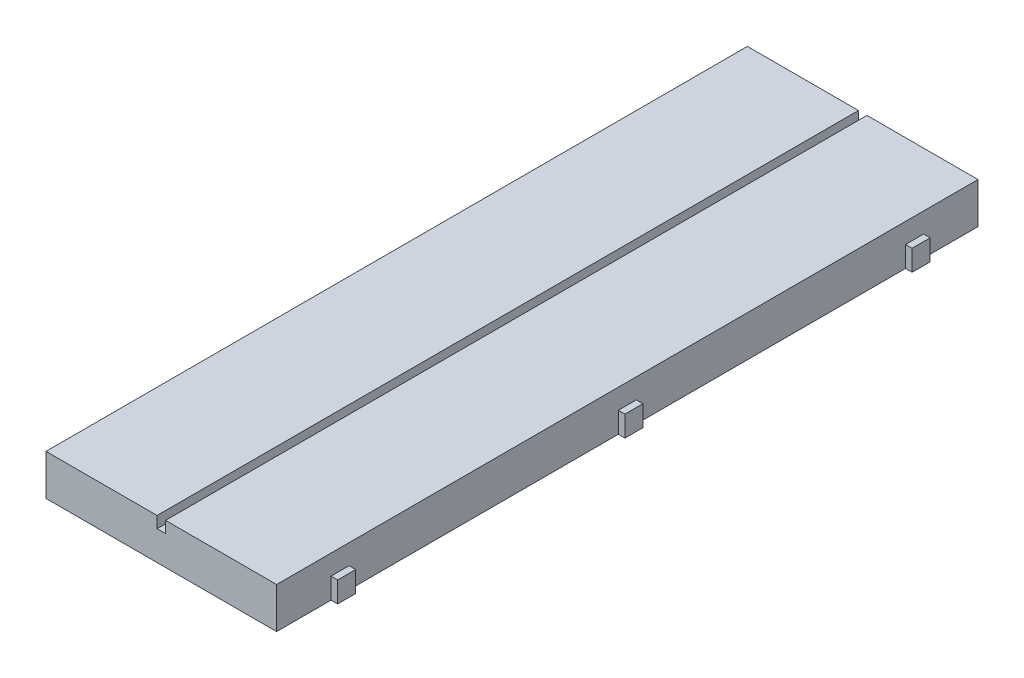
ISO-10303-21;
HEADER;
FILE_DESCRIPTION(('STEP AP214'),'2;1');
FILE_NAME('part.step','',(''),(''),'','','');
FILE_SCHEMA(('AUTOMOTIVE_DESIGN { 1 0 10303 214 1 1 1 1 }'));
ENDSEC;
DATA;
#1=APPLICATION_CONTEXT('core data for automotive mechanical design processes');
#2=APPLICATION_PROTOCOL_DEFINITION('international standard','automotive_design',2000,#1);
#3=PRODUCT_CONTEXT('',#1,'mechanical');
#4=PRODUCT('Part','Part','',(#3));
#5=PRODUCT_RELATED_PRODUCT_CATEGORY('part','',(#4));
#6=PRODUCT_DEFINITION_FORMATION('','',#4);
#7=PRODUCT_DEFINITION_CONTEXT('part definition',#1,'design');
#8=PRODUCT_DEFINITION('design','',#6,#7);
#9=PRODUCT_DEFINITION_SHAPE('','',#8);
#10=(LENGTH_UNIT() NAMED_UNIT(*) SI_UNIT(.MILLI.,.METRE.));
#11=(NAMED_UNIT(*) PLANE_ANGLE_UNIT() SI_UNIT($,.RADIAN.));
#12=(NAMED_UNIT(*) SI_UNIT($,.STERADIAN.) SOLID_ANGLE_UNIT());
#13=UNCERTAINTY_MEASURE_WITH_UNIT(LENGTH_MEASURE(1.E-05),#10,'distance_accuracy_value','');
#14=(GEOMETRIC_REPRESENTATION_CONTEXT(3) GLOBAL_UNCERTAINTY_ASSIGNED_CONTEXT((#13)) GLOBAL_UNIT_ASSIGNED_CONTEXT((#10,
#11,#12)) REPRESENTATION_CONTEXT('',''));
#15=CARTESIAN_POINT('',(0.,0.,0.));
#16=DIRECTION('',(0.,0.,1.));
#17=DIRECTION('',(1.,0.,0.));
#18=AXIS2_PLACEMENT_3D('',#15,#16,#17);
#19=CARTESIAN_POINT('',(0.,0.,0.));
#20=DIRECTION('',(0.,-1.,0.));
#21=DIRECTION('',(0.,0.,-1.));
#22=AXIS2_PLACEMENT_3D('',#19,#20,#21);
#23=PLANE('',#22);
#24=DIRECTION('',(-1.,0.,0.));
#25=VECTOR('',#24,1.);
#26=CARTESIAN_POINT('',(-27.125,0.,-82.5));
#27=LINE('',#26,#25);
#28=CARTESIAN_POINT('',(27.125,0.,-82.5));
#29=VERTEX_POINT('',#28);
#30=CARTESIAN_POINT('',(1.,0.,-82.5));
#31=VERTEX_POINT('',#30);
#32=EDGE_CURVE('E464',#29,#31,#27,.T.);
#33=ORIENTED_EDGE('',*,*,#32,.T.);
#34=DIRECTION('',(0.,0.,-1.));
#35=VECTOR('',#34,1.);
#36=CARTESIAN_POINT('',(1.,0.,82.5));
#37=LINE('',#36,#35);
#38=CARTESIAN_POINT('',(1.,0.,82.5));
#39=VERTEX_POINT('',#38);
#40=EDGE_CURVE('E255',#39,#31,#37,.T.);
#41=ORIENTED_EDGE('',*,*,#40,.F.);
#42=DIRECTION('',(1.,0.,0.));
#43=VECTOR('',#42,1.);
#44=CARTESIAN_POINT('',(-27.125,0.,82.5));
#45=LINE('',#44,#43);
#46=CARTESIAN_POINT('',(27.125,0.,82.5));
#47=VERTEX_POINT('',#46);
#48=EDGE_CURVE('E469',#39,#47,#45,.T.);
#49=ORIENTED_EDGE('',*,*,#48,.T.);
#50=DIRECTION('',(0.,0.,-1.));
#51=VECTOR('',#50,1.);
#52=CARTESIAN_POINT('',(27.125,0.,82.5));
#53=LINE('',#52,#51);
#54=EDGE_CURVE('E443',#47,#29,#53,.T.);
#55=ORIENTED_EDGE('',*,*,#54,.T.);
#56=EDGE_LOOP('',(#33,#41,#49,#55));
#57=FACE_BOUND('',#56,.T.);
#58=ADVANCED_FACE('F39',(#57),#23,.F.);
#59=CARTESIAN_POINT('',(27.125,-9.6,82.5));
#60=DIRECTION('',(1.,0.,0.));
#61=DIRECTION('',(0.,0.,-1.));
#62=AXIS2_PLACEMENT_3D('',#59,#60,#61);
#63=PLANE('',#62);
#64=DIRECTION('',(0.,0.,-1.));
#65=VECTOR('',#64,1.);
#66=CARTESIAN_POINT('',(27.125,-4.70000000000002,82.5));
#67=LINE('',#66,#65);
#68=CARTESIAN_POINT('',(27.125,-4.70000000000002,69.7));
#69=VERTEX_POINT('',#68);
#70=CARTESIAN_POINT('',(27.125,-4.70000000000002,65.4499999999999));
#71=VERTEX_POINT('',#70);
#72=EDGE_CURVE('E11',#69,#71,#67,.T.);
#73=ORIENTED_EDGE('',*,*,#72,.T.);
#74=DIRECTION('',(0.,-1.,0.));
#75=VECTOR('',#74,1.);
#76=CARTESIAN_POINT('',(27.125,-9.6,65.4499999999999));
#77=LINE('',#76,#75);
#78=CARTESIAN_POINT('',(27.125,-9.6,65.4499999999999));
#79=VERTEX_POINT('',#78);
#80=EDGE_CURVE('E389',#71,#79,#77,.T.);
#81=ORIENTED_EDGE('',*,*,#80,.T.);
#82=DIRECTION('',(0.,0.,-1.));
#83=VECTOR('',#82,1.);
#84=CARTESIAN_POINT('',(27.125,-9.6,82.5));
#85=LINE('',#84,#83);
#86=CARTESIAN_POINT('',(27.125,-9.6,2.125));
#87=VERTEX_POINT('',#86);
#88=EDGE_CURVE('E448',#79,#87,#85,.T.);
#89=ORIENTED_EDGE('',*,*,#88,.T.);
#90=DIRECTION('',(0.,-1.,0.));
#91=VECTOR('',#90,1.);
#92=CARTESIAN_POINT('',(27.125,-9.60000000000001,2.125));
#93=LINE('',#92,#91);
#94=CARTESIAN_POINT('',(27.125,-4.7,2.125));
#95=VERTEX_POINT('',#94);
#96=EDGE_CURVE('E415',#95,#87,#93,.T.);
#97=ORIENTED_EDGE('',*,*,#96,.F.);
#98=DIRECTION('',(0.,0.,-1.));
#99=VECTOR('',#98,1.);
#100=CARTESIAN_POINT('',(27.125,-4.7,82.5));
#101=LINE('',#100,#99);
#102=CARTESIAN_POINT('',(27.125,-4.7,-2.125));
#103=VERTEX_POINT('',#102);
#104=EDGE_CURVE('E47',#95,#103,#101,.T.);
#105=ORIENTED_EDGE('',*,*,#104,.T.);
#106=DIRECTION('',(0.,-1.,0.));
#107=VECTOR('',#106,1.);
#108=CARTESIAN_POINT('',(27.125,-9.60000000000001,-2.125));
#109=LINE('',#108,#107);
#110=CARTESIAN_POINT('',(27.125,-9.6,-2.125));
#111=VERTEX_POINT('',#110);
#112=EDGE_CURVE('E412',#103,#111,#109,.T.);
#113=ORIENTED_EDGE('',*,*,#112,.T.);
#114=CARTESIAN_POINT('',(27.125,-9.6,-65.4499999999999));
#115=VERTEX_POINT('',#114);
#116=EDGE_CURVE('E505',#111,#115,#85,.T.);
#117=ORIENTED_EDGE('',*,*,#116,.T.);
#118=DIRECTION('',(0.,1.,0.));
#119=VECTOR('',#118,1.);
#120=CARTESIAN_POINT('',(27.125,-9.6,-65.4499999999999));
#121=LINE('',#120,#119);
#122=CARTESIAN_POINT('',(27.125,-4.7,-65.4499999999999));
#123=VERTEX_POINT('',#122);
#124=EDGE_CURVE('E438',#115,#123,#121,.T.);
#125=ORIENTED_EDGE('',*,*,#124,.T.);
#126=DIRECTION('',(0.,0.,-1.));
#127=VECTOR('',#126,1.);
#128=CARTESIAN_POINT('',(27.125,-4.7,82.5));
#129=LINE('',#128,#127);
#130=CARTESIAN_POINT('',(27.125,-4.7,-69.7));
#131=VERTEX_POINT('',#130);
#132=EDGE_CURVE('E476',#123,#131,#129,.T.);
#133=ORIENTED_EDGE('',*,*,#132,.T.);
#134=DIRECTION('',(0.,1.,0.));
#135=VECTOR('',#134,1.);
#136=CARTESIAN_POINT('',(27.125,-9.6,-69.7));
#137=LINE('',#136,#135);
#138=CARTESIAN_POINT('',(27.125,-9.6,-69.7));
#139=VERTEX_POINT('',#138);
#140=EDGE_CURVE('E441',#139,#131,#137,.T.);
#141=ORIENTED_EDGE('',*,*,#140,.F.);
#142=CARTESIAN_POINT('',(27.125,-9.6,-82.5));
#143=VERTEX_POINT('',#142);
#144=EDGE_CURVE('E449',#139,#143,#85,.T.);
#145=ORIENTED_EDGE('',*,*,#144,.T.);
#146=DIRECTION('',(0.,1.,0.));
#147=VECTOR('',#146,1.);
#148=CARTESIAN_POINT('',(27.125,-9.6,-82.5));
#149=LINE('',#148,#147);
#150=EDGE_CURVE('E460',#143,#29,#149,.T.);
#151=ORIENTED_EDGE('',*,*,#150,.T.);
#152=ORIENTED_EDGE('',*,*,#54,.F.);
#153=DIRECTION('',(0.,1.,0.));
#154=VECTOR('',#153,1.);
#155=CARTESIAN_POINT('',(27.125,-9.6,82.5));
#156=LINE('',#155,#154);
#157=CARTESIAN_POINT('',(27.125,-9.6,82.5));
#158=VERTEX_POINT('',#157);
#159=EDGE_CURVE('E473',#158,#47,#156,.T.);
#160=ORIENTED_EDGE('',*,*,#159,.F.);
#161=CARTESIAN_POINT('',(27.125,-9.6,69.7));
#162=VERTEX_POINT('',#161);
#163=EDGE_CURVE('E444',#158,#162,#85,.T.);
#164=ORIENTED_EDGE('',*,*,#163,.T.);
#165=DIRECTION('',(0.,-1.,0.));
#166=VECTOR('',#165,1.);
#167=CARTESIAN_POINT('',(27.125,-9.6,69.7));
#168=LINE('',#167,#166);
#169=EDGE_CURVE('E387',#69,#162,#168,.T.);
#170=ORIENTED_EDGE('',*,*,#169,.F.);
#171=EDGE_LOOP('',(#73,#81,#89,#97,#105,#113,#117,#125,#133,#141,#145,#151,#152,#160,#164,#170));
#172=FACE_BOUND('',#171,.T.);
#173=ADVANCED_FACE('F41',(#172),#63,.T.);
#174=CARTESIAN_POINT('',(-27.125,-9.6,82.5));
#175=DIRECTION('',(0.,0.,1.));
#176=DIRECTION('',(1.,0.,0.));
#177=AXIS2_PLACEMENT_3D('',#174,#175,#176);
#178=PLANE('',#177);
#179=DIRECTION('',(0.,1.,0.));
#180=VECTOR('',#179,1.);
#181=CARTESIAN_POINT('',(1.,-2.7,82.5));
#182=LINE('',#181,#180);
#183=CARTESIAN_POINT('',(1.,-2.7,82.5));
#184=VERTEX_POINT('',#183);
#185=EDGE_CURVE('E280',#184,#39,#182,.T.);
#186=ORIENTED_EDGE('',*,*,#185,.F.);
#187=DIRECTION('',(1.,0.,0.));
#188=VECTOR('',#187,1.);
#189=CARTESIAN_POINT('',(-1.,-2.7,82.5));
#190=LINE('',#189,#188);
#191=CARTESIAN_POINT('',(-1.,-2.7,82.5));
#192=VERTEX_POINT('',#191);
#193=EDGE_CURVE('E260',#192,#184,#190,.T.);
#194=ORIENTED_EDGE('',*,*,#193,.F.);
#195=DIRECTION('',(0.,1.,0.));
#196=VECTOR('',#195,1.);
#197=CARTESIAN_POINT('',(-1.,-2.7,82.5));
#198=LINE('',#197,#196);
#199=CARTESIAN_POINT('',(-1.,0.,82.5));
#200=VERTEX_POINT('',#199);
#201=EDGE_CURVE('E283',#192,#200,#198,.T.);
#202=ORIENTED_EDGE('',*,*,#201,.T.);
#203=CARTESIAN_POINT('',(-27.125,0.,82.5));
#204=VERTEX_POINT('',#203);
#205=EDGE_CURVE('E470',#204,#200,#45,.T.);
#206=ORIENTED_EDGE('',*,*,#205,.F.);
#207=DIRECTION('',(0.,1.,0.));
#208=VECTOR('',#207,1.);
#209=CARTESIAN_POINT('',(-27.125,-9.6,82.5));
#210=LINE('',#209,#208);
#211=CARTESIAN_POINT('',(-27.125,-9.6,82.5));
#212=VERTEX_POINT('',#211);
#213=EDGE_CURVE('E477',#212,#204,#210,.T.);
#214=ORIENTED_EDGE('',*,*,#213,.F.);
#215=DIRECTION('',(1.,0.,0.));
#216=VECTOR('',#215,1.);
#217=CARTESIAN_POINT('',(-27.125,-9.6,82.5));
#218=LINE('',#217,#216);
#219=EDGE_CURVE('E456',#212,#158,#218,.T.);
#220=ORIENTED_EDGE('',*,*,#219,.T.);
#221=ORIENTED_EDGE('',*,*,#159,.T.);
#222=ORIENTED_EDGE('',*,*,#48,.F.);
#223=EDGE_LOOP('',(#186,#194,#202,#206,#214,#220,#221,#222));
#224=FACE_BOUND('',#223,.T.);
#225=ADVANCED_FACE('F529',(#224),#178,.T.);
#226=CARTESIAN_POINT('',(-27.125,-9.6,82.5));
#227=DIRECTION('',(-1.,0.,0.));
#228=DIRECTION('',(0.,0.,1.));
#229=AXIS2_PLACEMENT_3D('',#226,#227,#228);
#230=PLANE('',#229);
#231=DIRECTION('',(0.,1.,0.));
#232=VECTOR('',#231,1.);
#233=CARTESIAN_POINT('',(-27.125,-4.7,69.7));
#234=LINE('',#233,#232);
#235=CARTESIAN_POINT('',(-27.125,-9.6,69.7));
#236=VERTEX_POINT('',#235);
#237=CARTESIAN_POINT('',(-27.125,-4.7,69.7));
#238=VERTEX_POINT('',#237);
#239=EDGE_CURVE('E297',#236,#238,#234,.T.);
#240=ORIENTED_EDGE('',*,*,#239,.F.);
#241=DIRECTION('',(0.,0.,1.));
#242=VECTOR('',#241,1.);
#243=CARTESIAN_POINT('',(-27.125,-9.6,82.5));
#244=LINE('',#243,#242);
#245=EDGE_CURVE('E452',#236,#212,#244,.T.);
#246=ORIENTED_EDGE('',*,*,#245,.T.);
#247=ORIENTED_EDGE('',*,*,#213,.T.);
#248=DIRECTION('',(0.,0.,1.));
#249=VECTOR('',#248,1.);
#250=CARTESIAN_POINT('',(-27.125,0.,82.5));
#251=LINE('',#250,#249);
#252=CARTESIAN_POINT('',(-27.125,0.,-82.5));
#253=VERTEX_POINT('',#252);
#254=EDGE_CURVE('E466',#253,#204,#251,.T.);
#255=ORIENTED_EDGE('',*,*,#254,.F.);
#256=DIRECTION('',(0.,1.,0.));
#257=VECTOR('',#256,1.);
#258=CARTESIAN_POINT('',(-27.125,-9.6,-82.5));
#259=LINE('',#258,#257);
#260=CARTESIAN_POINT('',(-27.125,-9.6,-82.5));
#261=VERTEX_POINT('',#260);
#262=EDGE_CURVE('E479',#261,#253,#259,.T.);
#263=ORIENTED_EDGE('',*,*,#262,.F.);
#264=CARTESIAN_POINT('',(-27.125,-9.6,-69.7));
#265=VERTEX_POINT('',#264);
#266=EDGE_CURVE('E453',#261,#265,#244,.T.);
#267=ORIENTED_EDGE('',*,*,#266,.T.);
#268=DIRECTION('',(0.,-1.,0.));
#269=VECTOR('',#268,1.);
#270=CARTESIAN_POINT('',(-27.125,-4.7,-69.7));
#271=LINE('',#270,#269);
#272=CARTESIAN_POINT('',(-27.125,-4.7,-69.7));
#273=VERTEX_POINT('',#272);
#274=EDGE_CURVE('E301',#273,#265,#271,.T.);
#275=ORIENTED_EDGE('',*,*,#274,.F.);
#276=DIRECTION('',(0.,0.,-1.));
#277=VECTOR('',#276,1.);
#278=CARTESIAN_POINT('',(-27.125,-4.7,-69.7));
#279=LINE('',#278,#277);
#280=CARTESIAN_POINT('',(-27.125,-4.7,-65.45));
#281=VERTEX_POINT('',#280);
#282=EDGE_CURVE('E325',#281,#273,#279,.T.);
#283=ORIENTED_EDGE('',*,*,#282,.F.);
#284=DIRECTION('',(0.,1.,0.));
#285=VECTOR('',#284,1.);
#286=CARTESIAN_POINT('',(-27.125,-4.7,-65.45));
#287=LINE('',#286,#285);
#288=CARTESIAN_POINT('',(-27.125,-9.6,-65.45));
#289=VERTEX_POINT('',#288);
#290=EDGE_CURVE('E328',#289,#281,#287,.T.);
#291=ORIENTED_EDGE('',*,*,#290,.F.);
#292=CARTESIAN_POINT('',(-27.125,-9.6,-2.125));
#293=VERTEX_POINT('',#292);
#294=EDGE_CURVE('E457',#289,#293,#244,.T.);
#295=ORIENTED_EDGE('',*,*,#294,.T.);
#296=DIRECTION('',(0.,-1.,0.));
#297=VECTOR('',#296,1.);
#298=CARTESIAN_POINT('',(-27.125,-4.7,-2.125));
#299=LINE('',#298,#297);
#300=CARTESIAN_POINT('',(-27.125,-4.7,-2.125));
#301=VERTEX_POINT('',#300);
#302=EDGE_CURVE('E351',#301,#293,#299,.T.);
#303=ORIENTED_EDGE('',*,*,#302,.F.);
#304=DIRECTION('',(0.,0.,-1.));
#305=VECTOR('',#304,1.);
#306=CARTESIAN_POINT('',(-27.125,-4.7,-2.125));
#307=LINE('',#306,#305);
#308=CARTESIAN_POINT('',(-27.125,-4.7,2.125));
#309=VERTEX_POINT('',#308);
#310=EDGE_CURVE('E353',#309,#301,#307,.T.);
#311=ORIENTED_EDGE('',*,*,#310,.F.);
#312=DIRECTION('',(0.,1.,0.));
#313=VECTOR('',#312,1.);
#314=CARTESIAN_POINT('',(-27.125,-4.7,2.125));
#315=LINE('',#314,#313);
#316=CARTESIAN_POINT('',(-27.125,-9.6,2.125));
#317=VERTEX_POINT('',#316);
#318=EDGE_CURVE('E324',#317,#309,#315,.T.);
#319=ORIENTED_EDGE('',*,*,#318,.F.);
#320=CARTESIAN_POINT('',(-27.125,-9.6,65.45));
#321=VERTEX_POINT('',#320);
#322=EDGE_CURVE('E540',#317,#321,#244,.T.);
#323=ORIENTED_EDGE('',*,*,#322,.T.);
#324=DIRECTION('',(0.,-1.,0.));
#325=VECTOR('',#324,1.);
#326=CARTESIAN_POINT('',(-27.125,-4.7,65.45));
#327=LINE('',#326,#325);
#328=CARTESIAN_POINT('',(-27.125,-4.7,65.45));
#329=VERTEX_POINT('',#328);
#330=EDGE_CURVE('E291',#329,#321,#327,.T.);
#331=ORIENTED_EDGE('',*,*,#330,.F.);
#332=DIRECTION('',(0.,0.,-1.));
#333=VECTOR('',#332,1.);
#334=CARTESIAN_POINT('',(-27.125,-4.7,69.7));
#335=LINE('',#334,#333);
#336=EDGE_CURVE('E300',#238,#329,#335,.T.);
#337=ORIENTED_EDGE('',*,*,#336,.F.);
#338=EDGE_LOOP('',(#240,#246,#247,#255,#263,#267,#275,#283,#291,#295,#303,#311,#319,#323,#331,#337));
#339=FACE_BOUND('',#338,.T.);
#340=ADVANCED_FACE('F521',(#339),#230,.T.);
#341=CARTESIAN_POINT('',(-27.125,-9.6,-82.5));
#342=DIRECTION('',(0.,0.,-1.));
#343=DIRECTION('',(-1.,0.,0.));
#344=AXIS2_PLACEMENT_3D('',#341,#342,#343);
#345=PLANE('',#344);
#346=DIRECTION('',(0.,1.,0.));
#347=VECTOR('',#346,1.);
#348=CARTESIAN_POINT('',(1.,-2.7,-82.5));
#349=LINE('',#348,#347);
#350=CARTESIAN_POINT('',(1.,-2.7,-82.5));
#351=VERTEX_POINT('',#350);
#352=EDGE_CURVE('E249',#351,#31,#349,.T.);
#353=ORIENTED_EDGE('',*,*,#352,.T.);
#354=ORIENTED_EDGE('',*,*,#32,.F.);
#355=ORIENTED_EDGE('',*,*,#150,.F.);
#356=DIRECTION('',(-1.,0.,0.));
#357=VECTOR('',#356,1.);
#358=CARTESIAN_POINT('',(-27.125,-9.6,-82.5));
#359=LINE('',#358,#357);
#360=EDGE_CURVE('E447',#143,#261,#359,.T.);
#361=ORIENTED_EDGE('',*,*,#360,.T.);
#362=ORIENTED_EDGE('',*,*,#262,.T.);
#363=CARTESIAN_POINT('',(-1.,0.,-82.5));
#364=VERTEX_POINT('',#363);
#365=EDGE_CURVE('E463',#364,#253,#27,.T.);
#366=ORIENTED_EDGE('',*,*,#365,.F.);
#367=DIRECTION('',(0.,1.,0.));
#368=VECTOR('',#367,1.);
#369=CARTESIAN_POINT('',(-1.,-2.7,-82.5));
#370=LINE('',#369,#368);
#371=CARTESIAN_POINT('',(-1.,-2.7,-82.5));
#372=VERTEX_POINT('',#371);
#373=EDGE_CURVE('E54',#372,#364,#370,.T.);
#374=ORIENTED_EDGE('',*,*,#373,.F.);
#375=DIRECTION('',(-1.,0.,0.));
#376=VECTOR('',#375,1.);
#377=CARTESIAN_POINT('',(-1.,-2.7,-82.5));
#378=LINE('',#377,#376);
#379=EDGE_CURVE('E266',#351,#372,#378,.T.);
#380=ORIENTED_EDGE('',*,*,#379,.F.);
#381=EDGE_LOOP('',(#353,#354,#355,#361,#362,#366,#374,#380));
#382=FACE_BOUND('',#381,.T.);
#383=ADVANCED_FACE('F271',(#382),#345,.T.);
#384=CARTESIAN_POINT('',(0.,-9.6,0.));
#385=DIRECTION('',(0.,-1.,0.));
#386=DIRECTION('',(0.,0.,-1.));
#387=AXIS2_PLACEMENT_3D('',#384,#385,#386);
#388=PLANE('',#387);
#389=DIRECTION('',(-1.,0.,0.));
#390=VECTOR('',#389,1.);
#391=CARTESIAN_POINT('',(-25.575,-9.6,69.7));
#392=LINE('',#391,#390);
#393=CARTESIAN_POINT('',(-25.575,-9.6,69.7));
#394=VERTEX_POINT('',#393);
#395=EDGE_CURVE('E305',#394,#236,#392,.T.);
#396=ORIENTED_EDGE('',*,*,#395,.F.);
#397=DIRECTION('',(0.,0.,1.));
#398=VECTOR('',#397,1.);
#399=CARTESIAN_POINT('',(-25.575,-9.6,69.7));
#400=LINE('',#399,#398);
#401=CARTESIAN_POINT('',(-25.575,-9.6,65.45));
#402=VERTEX_POINT('',#401);
#403=EDGE_CURVE('E294',#402,#394,#400,.T.);
#404=ORIENTED_EDGE('',*,*,#403,.F.);
#405=DIRECTION('',(-1.,0.,0.));
#406=VECTOR('',#405,1.);
#407=CARTESIAN_POINT('',(-25.575,-9.6,65.45));
#408=LINE('',#407,#406);
#409=EDGE_CURVE('E308',#402,#321,#408,.T.);
#410=ORIENTED_EDGE('',*,*,#409,.T.);
#411=ORIENTED_EDGE('',*,*,#322,.F.);
#412=DIRECTION('',(-1.,0.,0.));
#413=VECTOR('',#412,1.);
#414=CARTESIAN_POINT('',(-25.575,-9.6,2.125));
#415=LINE('',#414,#413);
#416=CARTESIAN_POINT('',(-25.575,-9.6,2.125));
#417=VERTEX_POINT('',#416);
#418=EDGE_CURVE('E282',#417,#317,#415,.T.);
#419=ORIENTED_EDGE('',*,*,#418,.F.);
#420=DIRECTION('',(0.,0.,1.));
#421=VECTOR('',#420,1.);
#422=CARTESIAN_POINT('',(-25.575,-9.6,-2.125));
#423=LINE('',#422,#421);
#424=CARTESIAN_POINT('',(-25.575,-9.6,-2.125));
#425=VERTEX_POINT('',#424);
#426=EDGE_CURVE('E344',#425,#417,#423,.T.);
#427=ORIENTED_EDGE('',*,*,#426,.F.);
#428=DIRECTION('',(-1.,0.,0.));
#429=VECTOR('',#428,1.);
#430=CARTESIAN_POINT('',(-25.575,-9.6,-2.125));
#431=LINE('',#430,#429);
#432=EDGE_CURVE('E347',#425,#293,#431,.T.);
#433=ORIENTED_EDGE('',*,*,#432,.T.);
#434=ORIENTED_EDGE('',*,*,#294,.F.);
#435=DIRECTION('',(-1.,0.,0.));
#436=VECTOR('',#435,1.);
#437=CARTESIAN_POINT('',(-25.575,-9.6,-65.45));
#438=LINE('',#437,#436);
#439=CARTESIAN_POINT('',(-25.575,-9.6,-65.45));
#440=VERTEX_POINT('',#439);
#441=EDGE_CURVE('E318',#440,#289,#438,.T.);
#442=ORIENTED_EDGE('',*,*,#441,.F.);
#443=DIRECTION('',(0.,0.,1.));
#444=VECTOR('',#443,1.);
#445=CARTESIAN_POINT('',(-25.575,-9.6,-69.7));
#446=LINE('',#445,#444);
#447=CARTESIAN_POINT('',(-25.575,-9.6,-69.7));
#448=VERTEX_POINT('',#447);
#449=EDGE_CURVE('E338',#448,#440,#446,.T.);
#450=ORIENTED_EDGE('',*,*,#449,.F.);
#451=DIRECTION('',(-1.,0.,0.));
#452=VECTOR('',#451,1.);
#453=CARTESIAN_POINT('',(-25.575,-9.6,-69.7));
#454=LINE('',#453,#452);
#455=EDGE_CURVE('E314',#448,#265,#454,.T.);
#456=ORIENTED_EDGE('',*,*,#455,.T.);
#457=ORIENTED_EDGE('',*,*,#266,.F.);
#458=ORIENTED_EDGE('',*,*,#360,.F.);
#459=ORIENTED_EDGE('',*,*,#144,.F.);
#460=DIRECTION('',(-1.,0.,0.));
#461=VECTOR('',#460,1.);
#462=CARTESIAN_POINT('',(28.675,-9.6,-69.7));
#463=LINE('',#462,#461);
#464=CARTESIAN_POINT('',(28.675,-9.6,-69.7));
#465=VERTEX_POINT('',#464);
#466=EDGE_CURVE('E431',#465,#139,#463,.T.);
#467=ORIENTED_EDGE('',*,*,#466,.F.);
#468=DIRECTION('',(0.,0.,-1.));
#469=VECTOR('',#468,1.);
#470=CARTESIAN_POINT('',(28.675,-9.6,0.));
#471=LINE('',#470,#469);
#472=CARTESIAN_POINT('',(28.675,-9.6,-65.4499999999999));
#473=VERTEX_POINT('',#472);
#474=EDGE_CURVE('E423',#473,#465,#471,.T.);
#475=ORIENTED_EDGE('',*,*,#474,.F.);
#476=DIRECTION('',(-1.,0.,0.));
#477=VECTOR('',#476,1.);
#478=CARTESIAN_POINT('',(28.675,-9.6,-65.4499999999999));
#479=LINE('',#478,#477);
#480=EDGE_CURVE('E433',#473,#115,#479,.T.);
#481=ORIENTED_EDGE('',*,*,#480,.T.);
#482=ORIENTED_EDGE('',*,*,#116,.F.);
#483=DIRECTION('',(1.,0.,0.));
#484=VECTOR('',#483,1.);
#485=CARTESIAN_POINT('',(25.575,-9.6,-2.125));
#486=LINE('',#485,#484);
#487=CARTESIAN_POINT('',(28.675,-9.6,-2.125));
#488=VERTEX_POINT('',#487);
#489=EDGE_CURVE('E396',#111,#488,#486,.T.);
#490=ORIENTED_EDGE('',*,*,#489,.T.);
#491=DIRECTION('',(0.,0.,-1.));
#492=VECTOR('',#491,1.);
#493=CARTESIAN_POINT('',(28.675,-9.6,2.125));
#494=LINE('',#493,#492);
#495=CARTESIAN_POINT('',(28.675,-9.6,2.125));
#496=VERTEX_POINT('',#495);
#497=EDGE_CURVE('E406',#496,#488,#494,.T.);
#498=ORIENTED_EDGE('',*,*,#497,.F.);
#499=DIRECTION('',(1.,0.,0.));
#500=VECTOR('',#499,1.);
#501=CARTESIAN_POINT('',(25.575,-9.6,2.125));
#502=LINE('',#501,#500);
#503=EDGE_CURVE('E393',#87,#496,#502,.T.);
#504=ORIENTED_EDGE('',*,*,#503,.F.);
#505=ORIENTED_EDGE('',*,*,#88,.F.);
#506=DIRECTION('',(1.,0.,0.));
#507=VECTOR('',#506,1.);
#508=CARTESIAN_POINT('',(25.575,-9.6,65.4499999999999));
#509=LINE('',#508,#507);
#510=CARTESIAN_POINT('',(28.675,-9.6,65.4499999999999));
#511=VERTEX_POINT('',#510);
#512=EDGE_CURVE('E373',#79,#511,#509,.T.);
#513=ORIENTED_EDGE('',*,*,#512,.T.);
#514=DIRECTION('',(0.,0.,-1.));
#515=VECTOR('',#514,1.);
#516=CARTESIAN_POINT('',(28.675,-9.6,0.));
#517=LINE('',#516,#515);
#518=CARTESIAN_POINT('',(28.675,-9.6,69.7));
#519=VERTEX_POINT('',#518);
#520=EDGE_CURVE('E378',#519,#511,#517,.T.);
#521=ORIENTED_EDGE('',*,*,#520,.F.);
#522=DIRECTION('',(1.,0.,0.));
#523=VECTOR('',#522,1.);
#524=CARTESIAN_POINT('',(25.575,-9.6,69.7));
#525=LINE('',#524,#523);
#526=EDGE_CURVE('E371',#162,#519,#525,.T.);
#527=ORIENTED_EDGE('',*,*,#526,.F.);
#528=ORIENTED_EDGE('',*,*,#163,.F.);
#529=ORIENTED_EDGE('',*,*,#219,.F.);
#530=ORIENTED_EDGE('',*,*,#245,.F.);
#531=EDGE_LOOP('',(#396,#404,#410,#411,#419,#427,#433,#434,#442,#450,#456,#457,#458,#459,#467,
#475,#481,#482,#490,#498,#504,#505,#513,#521,#527,#528,#529,#530));
#532=FACE_BOUND('',#531,.T.);
#533=ADVANCED_FACE('F503',(#532),#388,.T.);
#534=ORIENTED_EDGE('',*,*,#205,.T.);
#535=DIRECTION('',(0.,0.,1.));
#536=VECTOR('',#535,1.);
#537=CARTESIAN_POINT('',(-1.,0.,82.5));
#538=LINE('',#537,#536);
#539=EDGE_CURVE('E269',#364,#200,#538,.T.);
#540=ORIENTED_EDGE('',*,*,#539,.F.);
#541=ORIENTED_EDGE('',*,*,#365,.T.);
#542=ORIENTED_EDGE('',*,*,#254,.T.);
#543=EDGE_LOOP('',(#534,#540,#541,#542));
#544=FACE_BOUND('',#543,.T.);
#545=ADVANCED_FACE('F525',(#544),#23,.F.);
#546=CARTESIAN_POINT('',(28.675,0.,-69.7));
#547=DIRECTION('',(0.,0.,-1.));
#548=DIRECTION('',(-1.,0.,0.));
#549=AXIS2_PLACEMENT_3D('',#546,#547,#548);
#550=PLANE('',#549);
#551=ORIENTED_EDGE('',*,*,#466,.T.);
#552=ORIENTED_EDGE('',*,*,#140,.T.);
#553=DIRECTION('',(-1.,0.,0.));
#554=VECTOR('',#553,1.);
#555=CARTESIAN_POINT('',(28.675,-4.7,-69.7));
#556=LINE('',#555,#554);
#557=CARTESIAN_POINT('',(28.675,-4.7,-69.7));
#558=VERTEX_POINT('',#557);
#559=EDGE_CURVE('E428',#558,#131,#556,.T.);
#560=ORIENTED_EDGE('',*,*,#559,.F.);
#561=DIRECTION('',(0.,-1.,0.));
#562=VECTOR('',#561,1.);
#563=CARTESIAN_POINT('',(28.675,0.,-69.7));
#564=LINE('',#563,#562);
#565=EDGE_CURVE('E425',#558,#465,#564,.T.);
#566=ORIENTED_EDGE('',*,*,#565,.T.);
#567=EDGE_LOOP('',(#551,#552,#560,#566));
#568=FACE_BOUND('',#567,.T.);
#569=ADVANCED_FACE('F587',(#568),#550,.T.);
#570=CARTESIAN_POINT('',(28.675,-4.7,0.));
#571=DIRECTION('',(0.,-1.,0.));
#572=DIRECTION('',(0.,0.,-1.));
#573=AXIS2_PLACEMENT_3D('',#570,#571,#572);
#574=PLANE('',#573);
#575=ORIENTED_EDGE('',*,*,#132,.F.);
#576=DIRECTION('',(-1.,0.,0.));
#577=VECTOR('',#576,1.);
#578=CARTESIAN_POINT('',(28.675,-4.7,-65.4499999999999));
#579=LINE('',#578,#577);
#580=CARTESIAN_POINT('',(28.675,-4.7,-65.4499999999999));
#581=VERTEX_POINT('',#580);
#582=EDGE_CURVE('E436',#581,#123,#579,.T.);
#583=ORIENTED_EDGE('',*,*,#582,.F.);
#584=DIRECTION('',(0.,0.,1.));
#585=VECTOR('',#584,1.);
#586=CARTESIAN_POINT('',(28.675,-4.7,0.));
#587=LINE('',#586,#585);
#588=EDGE_CURVE('E418',#558,#581,#587,.T.);
#589=ORIENTED_EDGE('',*,*,#588,.F.);
#590=ORIENTED_EDGE('',*,*,#559,.T.);
#591=EDGE_LOOP('',(#575,#583,#589,#590));
#592=FACE_BOUND('',#591,.T.);
#593=ADVANCED_FACE('F592',(#592),#574,.F.);
#594=CARTESIAN_POINT('',(28.675,0.,0.));
#595=DIRECTION('',(1.,0.,0.));
#596=DIRECTION('',(0.,0.,-1.));
#597=AXIS2_PLACEMENT_3D('',#594,#595,#596);
#598=PLANE('',#597);
#599=ORIENTED_EDGE('',*,*,#588,.T.);
#600=DIRECTION('',(0.,-1.,0.));
#601=VECTOR('',#600,1.);
#602=CARTESIAN_POINT('',(28.675,0.,-65.4499999999999));
#603=LINE('',#602,#601);
#604=EDGE_CURVE('E421',#581,#473,#603,.T.);
#605=ORIENTED_EDGE('',*,*,#604,.T.);
#606=ORIENTED_EDGE('',*,*,#474,.T.);
#607=ORIENTED_EDGE('',*,*,#565,.F.);
#608=EDGE_LOOP('',(#599,#605,#606,#607));
#609=FACE_BOUND('',#608,.T.);
#610=ADVANCED_FACE('F601',(#609),#598,.T.);
#611=CARTESIAN_POINT('',(28.675,0.,-65.4499999999999));
#612=DIRECTION('',(0.,0.,-1.));
#613=DIRECTION('',(-1.,0.,0.));
#614=AXIS2_PLACEMENT_3D('',#611,#612,#613);
#615=PLANE('',#614);
#616=ORIENTED_EDGE('',*,*,#124,.F.);
#617=ORIENTED_EDGE('',*,*,#480,.F.);
#618=ORIENTED_EDGE('',*,*,#604,.F.);
#619=ORIENTED_EDGE('',*,*,#582,.T.);
#620=EDGE_LOOP('',(#616,#617,#618,#619));
#621=FACE_BOUND('',#620,.T.);
#622=ADVANCED_FACE('F603',(#621),#615,.F.);
#623=CARTESIAN_POINT('',(25.575,-4.7,2.125));
#624=DIRECTION('',(0.,0.,1.));
#625=DIRECTION('',(0.,-1.,0.));
#626=AXIS2_PLACEMENT_3D('',#623,#624,#625);
#627=PLANE('',#626);
#628=DIRECTION('',(1.,0.,0.));
#629=VECTOR('',#628,1.);
#630=CARTESIAN_POINT('',(25.575,-4.7,2.125));
#631=LINE('',#630,#629);
#632=CARTESIAN_POINT('',(28.675,-4.7,2.125));
#633=VERTEX_POINT('',#632);
#634=EDGE_CURVE('E392',#95,#633,#631,.T.);
#635=ORIENTED_EDGE('',*,*,#634,.F.);
#636=ORIENTED_EDGE('',*,*,#96,.T.);
#637=ORIENTED_EDGE('',*,*,#503,.T.);
#638=DIRECTION('',(0.,-1.,0.));
#639=VECTOR('',#638,1.);
#640=CARTESIAN_POINT('',(28.675,-4.7,2.125));
#641=LINE('',#640,#639);
#642=EDGE_CURVE('E409',#633,#496,#641,.T.);
#643=ORIENTED_EDGE('',*,*,#642,.F.);
#644=EDGE_LOOP('',(#635,#636,#637,#643));
#645=FACE_BOUND('',#644,.T.);
#646=ADVANCED_FACE('F605',(#645),#627,.T.);
#647=CARTESIAN_POINT('',(25.575,-4.7,2.125));
#648=DIRECTION('',(0.,-1.,0.));
#649=DIRECTION('',(0.,0.,-1.));
#650=AXIS2_PLACEMENT_3D('',#647,#648,#649);
#651=PLANE('',#650);
#652=ORIENTED_EDGE('',*,*,#104,.F.);
#653=ORIENTED_EDGE('',*,*,#634,.T.);
#654=DIRECTION('',(0.,0.,-1.));
#655=VECTOR('',#654,1.);
#656=CARTESIAN_POINT('',(28.675,-4.7,2.125));
#657=LINE('',#656,#655);
#658=CARTESIAN_POINT('',(28.675,-4.7,-2.125));
#659=VERTEX_POINT('',#658);
#660=EDGE_CURVE('E395',#633,#659,#657,.T.);
#661=ORIENTED_EDGE('',*,*,#660,.T.);
#662=DIRECTION('',(1.,0.,0.));
#663=VECTOR('',#662,1.);
#664=CARTESIAN_POINT('',(25.575,-4.7,-2.125));
#665=LINE('',#664,#663);
#666=EDGE_CURVE('E398',#103,#659,#665,.T.);
#667=ORIENTED_EDGE('',*,*,#666,.F.);
#668=EDGE_LOOP('',(#652,#653,#661,#667));
#669=FACE_BOUND('',#668,.T.);
#670=ADVANCED_FACE('F494',(#669),#651,.F.);
#671=CARTESIAN_POINT('',(25.575,-4.7,-2.125));
#672=DIRECTION('',(0.,0.,1.));
#673=DIRECTION('',(0.,-1.,0.));
#674=AXIS2_PLACEMENT_3D('',#671,#672,#673);
#675=PLANE('',#674);
#676=ORIENTED_EDGE('',*,*,#112,.F.);
#677=ORIENTED_EDGE('',*,*,#666,.T.);
#678=DIRECTION('',(0.,-1.,0.));
#679=VECTOR('',#678,1.);
#680=CARTESIAN_POINT('',(28.675,-4.7,-2.125));
#681=LINE('',#680,#679);
#682=EDGE_CURVE('E403',#659,#488,#681,.T.);
#683=ORIENTED_EDGE('',*,*,#682,.T.);
#684=ORIENTED_EDGE('',*,*,#489,.F.);
#685=EDGE_LOOP('',(#676,#677,#683,#684));
#686=FACE_BOUND('',#685,.T.);
#687=ADVANCED_FACE('F492',(#686),#675,.F.);
#688=CARTESIAN_POINT('',(28.675,0.,0.));
#689=DIRECTION('',(1.,0.,0.));
#690=DIRECTION('',(0.,0.,-1.));
#691=AXIS2_PLACEMENT_3D('',#688,#689,#690);
#692=PLANE('',#691);
#693=ORIENTED_EDGE('',*,*,#642,.T.);
#694=ORIENTED_EDGE('',*,*,#497,.T.);
#695=ORIENTED_EDGE('',*,*,#682,.F.);
#696=ORIENTED_EDGE('',*,*,#660,.F.);
#697=EDGE_LOOP('',(#693,#694,#695,#696));
#698=FACE_BOUND('',#697,.T.);
#699=ADVANCED_FACE('F498',(#698),#692,.T.);
#700=CARTESIAN_POINT('',(28.675,0.,0.));
#701=DIRECTION('',(1.,0.,0.));
#702=DIRECTION('',(0.,0.,-1.));
#703=AXIS2_PLACEMENT_3D('',#700,#701,#702);
#704=PLANE('',#703);
#705=DIRECTION('',(0.,0.,-1.));
#706=VECTOR('',#705,1.);
#707=CARTESIAN_POINT('',(28.675,-4.69999999999999,0.));
#708=LINE('',#707,#706);
#709=CARTESIAN_POINT('',(28.675,-4.70000000000002,69.7));
#710=VERTEX_POINT('',#709);
#711=CARTESIAN_POINT('',(28.675,-4.70000000000002,65.4499999999999));
#712=VERTEX_POINT('',#711);
#713=EDGE_CURVE('E384',#710,#712,#708,.T.);
#714=ORIENTED_EDGE('',*,*,#713,.F.);
#715=DIRECTION('',(0.,-1.,0.));
#716=VECTOR('',#715,1.);
#717=CARTESIAN_POINT('',(28.675,0.,69.7));
#718=LINE('',#717,#716);
#719=EDGE_CURVE('E381',#710,#519,#718,.T.);
#720=ORIENTED_EDGE('',*,*,#719,.T.);
#721=ORIENTED_EDGE('',*,*,#520,.T.);
#722=DIRECTION('',(0.,-1.,0.));
#723=VECTOR('',#722,1.);
#724=CARTESIAN_POINT('',(28.675,0.,65.4499999999999));
#725=LINE('',#724,#723);
#726=EDGE_CURVE('E370',#712,#511,#725,.T.);
#727=ORIENTED_EDGE('',*,*,#726,.F.);
#728=EDGE_LOOP('',(#714,#720,#721,#727));
#729=FACE_BOUND('',#728,.T.);
#730=ADVANCED_FACE('F613',(#729),#704,.T.);
#731=CARTESIAN_POINT('',(25.575,0.,65.4499999999999));
#732=DIRECTION('',(0.,0.,1.));
#733=DIRECTION('',(1.,0.,0.));
#734=AXIS2_PLACEMENT_3D('',#731,#732,#733);
#735=PLANE('',#734);
#736=ORIENTED_EDGE('',*,*,#80,.F.);
#737=DIRECTION('',(1.,0.,0.));
#738=VECTOR('',#737,1.);
#739=CARTESIAN_POINT('',(25.575,-4.70000000000002,65.4499999999999));
#740=LINE('',#739,#738);
#741=EDGE_CURVE('E307',#71,#712,#740,.T.);
#742=ORIENTED_EDGE('',*,*,#741,.T.);
#743=ORIENTED_EDGE('',*,*,#726,.T.);
#744=ORIENTED_EDGE('',*,*,#512,.F.);
#745=EDGE_LOOP('',(#736,#742,#743,#744));
#746=FACE_BOUND('',#745,.T.);
#747=ADVANCED_FACE('F614',(#746),#735,.F.);
#748=CARTESIAN_POINT('',(25.575,0.,69.7));
#749=DIRECTION('',(0.,0.,1.));
#750=DIRECTION('',(1.,0.,0.));
#751=AXIS2_PLACEMENT_3D('',#748,#749,#750);
#752=PLANE('',#751);
#753=DIRECTION('',(1.,0.,0.));
#754=VECTOR('',#753,1.);
#755=CARTESIAN_POINT('',(25.575,-4.70000000000002,69.7));
#756=LINE('',#755,#754);
#757=EDGE_CURVE('E368',#69,#710,#756,.T.);
#758=ORIENTED_EDGE('',*,*,#757,.F.);
#759=ORIENTED_EDGE('',*,*,#169,.T.);
#760=ORIENTED_EDGE('',*,*,#526,.T.);
#761=ORIENTED_EDGE('',*,*,#719,.F.);
#762=EDGE_LOOP('',(#758,#759,#760,#761));
#763=FACE_BOUND('',#762,.T.);
#764=ADVANCED_FACE('F625',(#763),#752,.T.);
#765=CARTESIAN_POINT('',(25.575,-4.69999999999999,0.));
#766=DIRECTION('',(0.,-1.,0.));
#767=DIRECTION('',(0.,0.,-1.));
#768=AXIS2_PLACEMENT_3D('',#765,#766,#767);
#769=PLANE('',#768);
#770=ORIENTED_EDGE('',*,*,#72,.F.);
#771=ORIENTED_EDGE('',*,*,#757,.T.);
#772=ORIENTED_EDGE('',*,*,#713,.T.);
#773=ORIENTED_EDGE('',*,*,#741,.F.);
#774=EDGE_LOOP('',(#770,#771,#772,#773));
#775=FACE_BOUND('',#774,.T.);
#776=ADVANCED_FACE('F631',(#775),#769,.F.);
#777=CARTESIAN_POINT('',(-25.575,-4.7,2.125));
#778=DIRECTION('',(0.,0.,1.));
#779=DIRECTION('',(1.,0.,0.));
#780=AXIS2_PLACEMENT_3D('',#777,#778,#779);
#781=PLANE('',#780);
#782=ORIENTED_EDGE('',*,*,#318,.T.);
#783=DIRECTION('',(-1.,0.,0.));
#784=VECTOR('',#783,1.);
#785=CARTESIAN_POINT('',(-25.575,-4.7,2.125));
#786=LINE('',#785,#784);
#787=CARTESIAN_POINT('',(-25.575,-4.7,2.125));
#788=VERTEX_POINT('',#787);
#789=EDGE_CURVE('E342',#788,#309,#786,.T.);
#790=ORIENTED_EDGE('',*,*,#789,.F.);
#791=DIRECTION('',(0.,1.,0.));
#792=VECTOR('',#791,1.);
#793=CARTESIAN_POINT('',(-25.575,-4.7,2.125));
#794=LINE('',#793,#792);
#795=EDGE_CURVE('E354',#417,#788,#794,.T.);
#796=ORIENTED_EDGE('',*,*,#795,.F.);
#797=ORIENTED_EDGE('',*,*,#418,.T.);
#798=EDGE_LOOP('',(#782,#790,#796,#797));
#799=FACE_BOUND('',#798,.T.);
#800=ADVANCED_FACE('F635',(#799),#781,.F.);
#801=CARTESIAN_POINT('',(-25.575,-4.7,-2.125));
#802=DIRECTION('',(0.,0.,-1.));
#803=DIRECTION('',(-1.,0.,0.));
#804=AXIS2_PLACEMENT_3D('',#801,#802,#803);
#805=PLANE('',#804);
#806=ORIENTED_EDGE('',*,*,#302,.T.);
#807=ORIENTED_EDGE('',*,*,#432,.F.);
#808=DIRECTION('',(0.,-1.,0.));
#809=VECTOR('',#808,1.);
#810=CARTESIAN_POINT('',(-25.575,-4.7,-2.125));
#811=LINE('',#810,#809);
#812=CARTESIAN_POINT('',(-25.575,-4.7,-2.125));
#813=VERTEX_POINT('',#812);
#814=EDGE_CURVE('E361',#813,#425,#811,.T.);
#815=ORIENTED_EDGE('',*,*,#814,.F.);
#816=DIRECTION('',(-1.,0.,0.));
#817=VECTOR('',#816,1.);
#818=CARTESIAN_POINT('',(-25.575,-4.7,-2.125));
#819=LINE('',#818,#817);
#820=EDGE_CURVE('E345',#813,#301,#819,.T.);
#821=ORIENTED_EDGE('',*,*,#820,.T.);
#822=EDGE_LOOP('',(#806,#807,#815,#821));
#823=FACE_BOUND('',#822,.T.);
#824=ADVANCED_FACE('F556',(#823),#805,.F.);
#825=CARTESIAN_POINT('',(-25.575,-4.7,-2.125));
#826=DIRECTION('',(0.,1.,0.));
#827=DIRECTION('',(0.,0.,1.));
#828=AXIS2_PLACEMENT_3D('',#825,#826,#827);
#829=PLANE('',#828);
#830=ORIENTED_EDGE('',*,*,#310,.T.);
#831=ORIENTED_EDGE('',*,*,#820,.F.);
#832=DIRECTION('',(0.,0.,-1.));
#833=VECTOR('',#832,1.);
#834=CARTESIAN_POINT('',(-25.575,-4.7,-2.125));
#835=LINE('',#834,#833);
#836=EDGE_CURVE('E363',#788,#813,#835,.T.);
#837=ORIENTED_EDGE('',*,*,#836,.F.);
#838=ORIENTED_EDGE('',*,*,#789,.T.);
#839=EDGE_LOOP('',(#830,#831,#837,#838));
#840=FACE_BOUND('',#839,.T.);
#841=ADVANCED_FACE('F559',(#840),#829,.F.);
#842=CARTESIAN_POINT('',(-25.575,0.,0.));
#843=DIRECTION('',(-1.,0.,0.));
#844=DIRECTION('',(0.,0.,1.));
#845=AXIS2_PLACEMENT_3D('',#842,#843,#844);
#846=PLANE('',#845);
#847=ORIENTED_EDGE('',*,*,#795,.T.);
#848=ORIENTED_EDGE('',*,*,#836,.T.);
#849=ORIENTED_EDGE('',*,*,#814,.T.);
#850=ORIENTED_EDGE('',*,*,#426,.T.);
#851=EDGE_LOOP('',(#847,#848,#849,#850));
#852=FACE_BOUND('',#851,.T.);
#853=ADVANCED_FACE('F637',(#852),#846,.T.);
#854=CARTESIAN_POINT('',(-25.575,-4.7,-69.7));
#855=DIRECTION('',(0.,0.,-1.));
#856=DIRECTION('',(-1.,0.,0.));
#857=AXIS2_PLACEMENT_3D('',#854,#855,#856);
#858=PLANE('',#857);
#859=ORIENTED_EDGE('',*,*,#274,.T.);
#860=ORIENTED_EDGE('',*,*,#455,.F.);
#861=DIRECTION('',(0.,-1.,0.));
#862=VECTOR('',#861,1.);
#863=CARTESIAN_POINT('',(-25.575,-4.7,-69.7));
#864=LINE('',#863,#862);
#865=CARTESIAN_POINT('',(-25.575,-4.7,-69.7));
#866=VERTEX_POINT('',#865);
#867=EDGE_CURVE('E329',#866,#448,#864,.T.);
#868=ORIENTED_EDGE('',*,*,#867,.F.);
#869=DIRECTION('',(-1.,0.,0.));
#870=VECTOR('',#869,1.);
#871=CARTESIAN_POINT('',(-25.575,-4.7,-69.7));
#872=LINE('',#871,#870);
#873=EDGE_CURVE('E322',#866,#273,#872,.T.);
#874=ORIENTED_EDGE('',*,*,#873,.T.);
#875=EDGE_LOOP('',(#859,#860,#868,#874));
#876=FACE_BOUND('',#875,.T.);
#877=ADVANCED_FACE('F640',(#876),#858,.F.);
#878=CARTESIAN_POINT('',(-25.575,-4.7,-69.7));
#879=DIRECTION('',(0.,1.,0.));
#880=DIRECTION('',(0.,0.,1.));
#881=AXIS2_PLACEMENT_3D('',#878,#879,#880);
#882=PLANE('',#881);
#883=ORIENTED_EDGE('',*,*,#282,.T.);
#884=ORIENTED_EDGE('',*,*,#873,.F.);
#885=DIRECTION('',(0.,0.,-1.));
#886=VECTOR('',#885,1.);
#887=CARTESIAN_POINT('',(-25.575,-4.7,-69.7));
#888=LINE('',#887,#886);
#889=CARTESIAN_POINT('',(-25.575,-4.7,-65.45));
#890=VERTEX_POINT('',#889);
#891=EDGE_CURVE('E317',#890,#866,#888,.T.);
#892=ORIENTED_EDGE('',*,*,#891,.F.);
#893=DIRECTION('',(-1.,0.,0.));
#894=VECTOR('',#893,1.);
#895=CARTESIAN_POINT('',(-25.575,-4.7,-65.45));
#896=LINE('',#895,#894);
#897=EDGE_CURVE('E320',#890,#281,#896,.T.);
#898=ORIENTED_EDGE('',*,*,#897,.T.);
#899=EDGE_LOOP('',(#883,#884,#892,#898));
#900=FACE_BOUND('',#899,.T.);
#901=ADVANCED_FACE('F653',(#900),#882,.F.);
#902=CARTESIAN_POINT('',(-25.575,-4.7,-65.45));
#903=DIRECTION('',(0.,0.,1.));
#904=DIRECTION('',(1.,0.,0.));
#905=AXIS2_PLACEMENT_3D('',#902,#903,#904);
#906=PLANE('',#905);
#907=ORIENTED_EDGE('',*,*,#290,.T.);
#908=ORIENTED_EDGE('',*,*,#897,.F.);
#909=DIRECTION('',(0.,1.,0.));
#910=VECTOR('',#909,1.);
#911=CARTESIAN_POINT('',(-25.575,-4.7,-65.45));
#912=LINE('',#911,#910);
#913=EDGE_CURVE('E335',#440,#890,#912,.T.);
#914=ORIENTED_EDGE('',*,*,#913,.F.);
#915=ORIENTED_EDGE('',*,*,#441,.T.);
#916=EDGE_LOOP('',(#907,#908,#914,#915));
#917=FACE_BOUND('',#916,.T.);
#918=ADVANCED_FACE('F651',(#917),#906,.F.);
#919=CARTESIAN_POINT('',(-25.575,0.,0.));
#920=DIRECTION('',(-1.,0.,0.));
#921=DIRECTION('',(0.,0.,1.));
#922=AXIS2_PLACEMENT_3D('',#919,#920,#921);
#923=PLANE('',#922);
#924=ORIENTED_EDGE('',*,*,#867,.T.);
#925=ORIENTED_EDGE('',*,*,#449,.T.);
#926=ORIENTED_EDGE('',*,*,#913,.T.);
#927=ORIENTED_EDGE('',*,*,#891,.T.);
#928=EDGE_LOOP('',(#924,#925,#926,#927));
#929=FACE_BOUND('',#928,.T.);
#930=ADVANCED_FACE('F648',(#929),#923,.T.);
#931=CARTESIAN_POINT('',(-25.575,-4.7,69.7));
#932=DIRECTION('',(0.,0.,1.));
#933=DIRECTION('',(1.,0.,0.));
#934=AXIS2_PLACEMENT_3D('',#931,#932,#933);
#935=PLANE('',#934);
#936=ORIENTED_EDGE('',*,*,#239,.T.);
#937=DIRECTION('',(-1.,0.,0.));
#938=VECTOR('',#937,1.);
#939=CARTESIAN_POINT('',(-25.575,-4.7,69.7));
#940=LINE('',#939,#938);
#941=CARTESIAN_POINT('',(-25.575,-4.7,69.7));
#942=VERTEX_POINT('',#941);
#943=EDGE_CURVE('E296',#942,#238,#940,.T.);
#944=ORIENTED_EDGE('',*,*,#943,.F.);
#945=DIRECTION('',(0.,1.,0.));
#946=VECTOR('',#945,1.);
#947=CARTESIAN_POINT('',(-25.575,-4.7,69.7));
#948=LINE('',#947,#946);
#949=EDGE_CURVE('E287',#394,#942,#948,.T.);
#950=ORIENTED_EDGE('',*,*,#949,.F.);
#951=ORIENTED_EDGE('',*,*,#395,.T.);
#952=EDGE_LOOP('',(#936,#944,#950,#951));
#953=FACE_BOUND('',#952,.T.);
#954=ADVANCED_FACE('F568',(#953),#935,.F.);
#955=CARTESIAN_POINT('',(-25.575,-4.7,65.45));
#956=DIRECTION('',(0.,0.,-1.));
#957=DIRECTION('',(-1.,0.,0.));
#958=AXIS2_PLACEMENT_3D('',#955,#956,#957);
#959=PLANE('',#958);
#960=ORIENTED_EDGE('',*,*,#330,.T.);
#961=ORIENTED_EDGE('',*,*,#409,.F.);
#962=DIRECTION('',(0.,-1.,0.));
#963=VECTOR('',#962,1.);
#964=CARTESIAN_POINT('',(-25.575,-4.7,65.45));
#965=LINE('',#964,#963);
#966=CARTESIAN_POINT('',(-25.575,-4.7,65.45));
#967=VERTEX_POINT('',#966);
#968=EDGE_CURVE('E62',#967,#402,#965,.T.);
#969=ORIENTED_EDGE('',*,*,#968,.F.);
#970=DIRECTION('',(-1.,0.,0.));
#971=VECTOR('',#970,1.);
#972=CARTESIAN_POINT('',(-25.575,-4.7,65.45));
#973=LINE('',#972,#971);
#974=EDGE_CURVE('E311',#967,#329,#973,.T.);
#975=ORIENTED_EDGE('',*,*,#974,.T.);
#976=EDGE_LOOP('',(#960,#961,#969,#975));
#977=FACE_BOUND('',#976,.T.);
#978=ADVANCED_FACE('F563',(#977),#959,.F.);
#979=CARTESIAN_POINT('',(-25.575,-4.7,69.7));
#980=DIRECTION('',(0.,1.,0.));
#981=DIRECTION('',(0.,0.,1.));
#982=AXIS2_PLACEMENT_3D('',#979,#980,#981);
#983=PLANE('',#982);
#984=ORIENTED_EDGE('',*,*,#336,.T.);
#985=ORIENTED_EDGE('',*,*,#974,.F.);
#986=DIRECTION('',(0.,0.,-1.));
#987=VECTOR('',#986,1.);
#988=CARTESIAN_POINT('',(-25.575,-4.7,69.7));
#989=LINE('',#988,#987);
#990=EDGE_CURVE('E290',#942,#967,#989,.T.);
#991=ORIENTED_EDGE('',*,*,#990,.F.);
#992=ORIENTED_EDGE('',*,*,#943,.T.);
#993=EDGE_LOOP('',(#984,#985,#991,#992));
#994=FACE_BOUND('',#993,.T.);
#995=ADVANCED_FACE('F565',(#994),#983,.F.);
#996=CARTESIAN_POINT('',(-25.575,0.,0.));
#997=DIRECTION('',(1.,0.,0.));
#998=DIRECTION('',(0.,0.,-1.));
#999=AXIS2_PLACEMENT_3D('',#996,#997,#998);
#1000=PLANE('',#999);
#1001=ORIENTED_EDGE('',*,*,#949,.T.);
#1002=ORIENTED_EDGE('',*,*,#990,.T.);
#1003=ORIENTED_EDGE('',*,*,#968,.T.);
#1004=ORIENTED_EDGE('',*,*,#403,.T.);
#1005=EDGE_LOOP('',(#1001,#1002,#1003,#1004));
#1006=FACE_BOUND('',#1005,.T.);
#1007=ADVANCED_FACE('F569',(#1006),#1000,.F.);
#1008=CARTESIAN_POINT('',(1.,-2.7,82.5));
#1009=DIRECTION('',(1.,0.,0.));
#1010=DIRECTION('',(0.,0.,-1.));
#1011=AXIS2_PLACEMENT_3D('',#1008,#1009,#1010);
#1012=PLANE('',#1011);
#1013=ORIENTED_EDGE('',*,*,#40,.T.);
#1014=ORIENTED_EDGE('',*,*,#352,.F.);
#1015=DIRECTION('',(0.,0.,-1.));
#1016=VECTOR('',#1015,1.);
#1017=CARTESIAN_POINT('',(1.,-2.7,82.5));
#1018=LINE('',#1017,#1016);
#1019=EDGE_CURVE('E252',#184,#351,#1018,.T.);
#1020=ORIENTED_EDGE('',*,*,#1019,.F.);
#1021=ORIENTED_EDGE('',*,*,#185,.T.);
#1022=EDGE_LOOP('',(#1013,#1014,#1020,#1021));
#1023=FACE_BOUND('',#1022,.T.);
#1024=ADVANCED_FACE('F251',(#1023),#1012,.F.);
#1025=CARTESIAN_POINT('',(-1.,-2.7,82.5));
#1026=DIRECTION('',(-1.,0.,0.));
#1027=DIRECTION('',(0.,0.,1.));
#1028=AXIS2_PLACEMENT_3D('',#1025,#1026,#1027);
#1029=PLANE('',#1028);
#1030=ORIENTED_EDGE('',*,*,#539,.T.);
#1031=ORIENTED_EDGE('',*,*,#201,.F.);
#1032=DIRECTION('',(0.,0.,1.));
#1033=VECTOR('',#1032,1.);
#1034=CARTESIAN_POINT('',(-1.,-2.7,82.5));
#1035=LINE('',#1034,#1033);
#1036=EDGE_CURVE('E273',#372,#192,#1035,.T.);
#1037=ORIENTED_EDGE('',*,*,#1036,.F.);
#1038=ORIENTED_EDGE('',*,*,#373,.T.);
#1039=EDGE_LOOP('',(#1030,#1031,#1037,#1038));
#1040=FACE_BOUND('',#1039,.T.);
#1041=ADVANCED_FACE('F527',(#1040),#1029,.F.);
#1042=CARTESIAN_POINT('',(0.,-2.7,0.));
#1043=DIRECTION('',(0.,-1.,0.));
#1044=DIRECTION('',(0.,0.,-1.));
#1045=AXIS2_PLACEMENT_3D('',#1042,#1043,#1044);
#1046=PLANE('',#1045);
#1047=ORIENTED_EDGE('',*,*,#1019,.T.);
#1048=ORIENTED_EDGE('',*,*,#379,.T.);
#1049=ORIENTED_EDGE('',*,*,#1036,.T.);
#1050=ORIENTED_EDGE('',*,*,#193,.T.);
#1051=EDGE_LOOP('',(#1047,#1048,#1049,#1050));
#1052=FACE_BOUND('',#1051,.T.);
#1053=ADVANCED_FACE('F264',(#1052),#1046,.F.);
#1054=CLOSED_SHELL('',(#58,#173,#225,#340,#383,#533,#545,#569,#593,#610,#622,#646,#670,#687,
#699,#730,#747,#764,#776,#800,#824,#841,#853,#877,#901,#918,#930,#954,#978,#995,#1007,#1024,
#1041,#1053));
#1055=MANIFOLD_SOLID_BREP('B2',#1054);
#1056=ADVANCED_BREP_SHAPE_REPRESENTATION('',(#18,#1055),#14);
#1057=SHAPE_DEFINITION_REPRESENTATION(#9,#1056);
ENDSEC;
END-ISO-10303-21;
